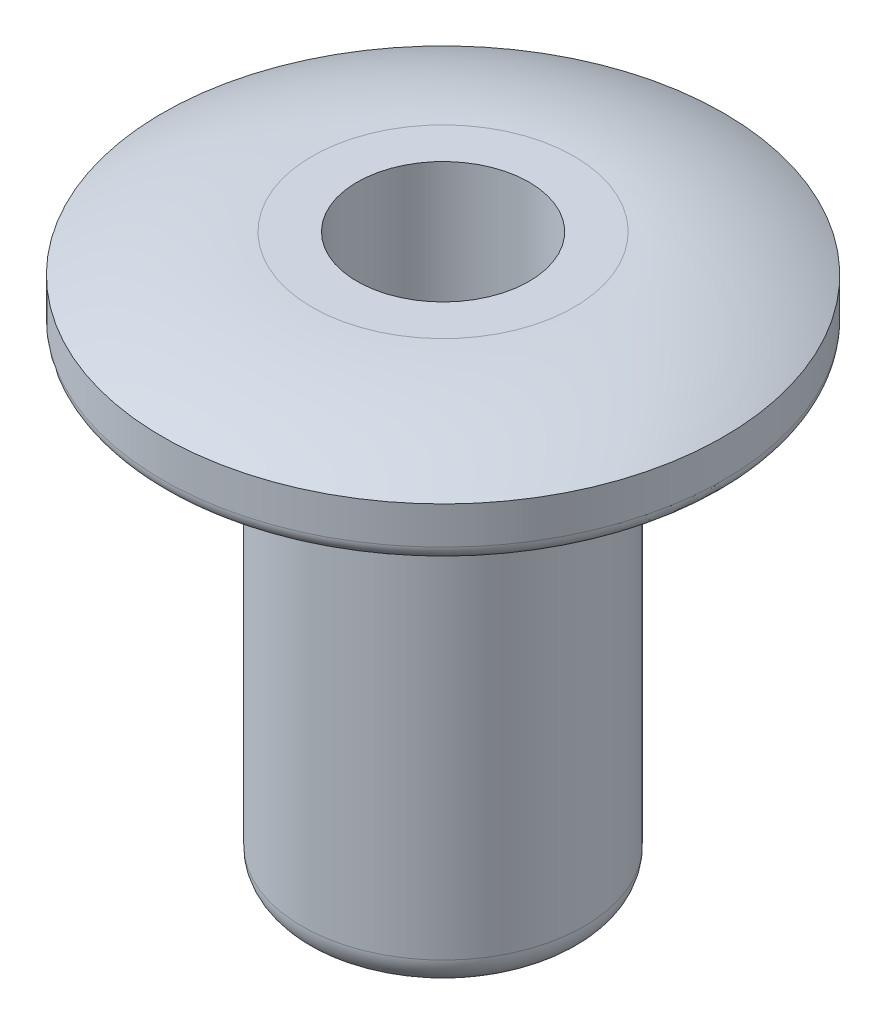
ISO-10303-21;
HEADER;
FILE_DESCRIPTION(('STEP AP214'),'2;1');
FILE_NAME('part.step','',(''),(''),'','','');
FILE_SCHEMA(('AUTOMOTIVE_DESIGN { 1 0 10303 214 1 1 1 1 }'));
ENDSEC;
DATA;
#1=APPLICATION_CONTEXT('core data for automotive mechanical design processes');
#2=APPLICATION_PROTOCOL_DEFINITION('international standard','automotive_design',2000,#1);
#3=PRODUCT_CONTEXT('',#1,'mechanical');
#4=PRODUCT('Part','Part','',(#3));
#5=PRODUCT_RELATED_PRODUCT_CATEGORY('part','',(#4));
#6=PRODUCT_DEFINITION_FORMATION('','',#4);
#7=PRODUCT_DEFINITION_CONTEXT('part definition',#1,'design');
#8=PRODUCT_DEFINITION('design','',#6,#7);
#9=PRODUCT_DEFINITION_SHAPE('','',#8);
#10=(LENGTH_UNIT() NAMED_UNIT(*) SI_UNIT(.MILLI.,.METRE.));
#11=(NAMED_UNIT(*) PLANE_ANGLE_UNIT() SI_UNIT($,.RADIAN.));
#12=(NAMED_UNIT(*) SI_UNIT($,.STERADIAN.) SOLID_ANGLE_UNIT());
#13=UNCERTAINTY_MEASURE_WITH_UNIT(LENGTH_MEASURE(1.E-05),#10,'distance_accuracy_value','');
#14=(GEOMETRIC_REPRESENTATION_CONTEXT(3) GLOBAL_UNCERTAINTY_ASSIGNED_CONTEXT((#13)) GLOBAL_UNIT_ASSIGNED_CONTEXT((#10,
#11,#12)) REPRESENTATION_CONTEXT('',''));
#15=CARTESIAN_POINT('',(0.,0.,0.));
#16=DIRECTION('',(0.,0.,1.));
#17=DIRECTION('',(1.,0.,0.));
#18=AXIS2_PLACEMENT_3D('',#15,#16,#17);
#19=CARTESIAN_POINT('',(0.,4.12749999999999,-2.2225));
#20=DIRECTION('',(1.,0.,0.));
#21=DIRECTION('',(0.,0.,-1.));
#22=AXIS2_PLACEMENT_3D('',#19,#20,#21);
#23=CIRCLE('',#22,5.39750000000001);
#24=TRIMMED_CURVE('',#23,(PARAMETER_VALUE(-1.99518603538808)),
(PARAMETER_VALUE(1.99518603538808)),.T.,.PARAMETER.);
#25=CARTESIAN_POINT('',(0.,4.12749999999999,0.));
#26=DIRECTION('',(0.,-1.,0.));
#27=AXIS1_PLACEMENT('',#25,#26);
#28=SURFACE_OF_REVOLUTION('',#24,#27);
#29=CARTESIAN_POINT('',(0.,8.89,0.));
#30=DIRECTION('',(0.,-1.,0.));
#31=DIRECTION('',(0.,0.,-1.));
#32=AXIS2_PLACEMENT_3D('',#29,#30,#31);
#33=CIRCLE('',#32,4.7625);
#34=CARTESIAN_POINT('',(0.,8.89,-4.7625));
#35=VERTEX_POINT('',#34);
#36=EDGE_CURVE('E58',#35,#35,#33,.T.);
#37=ORIENTED_EDGE('',*,*,#36,.F.);
#38=EDGE_LOOP('',(#37));
#39=FACE_BOUND('',#38,.T.);
#40=CARTESIAN_POINT('',(0.,9.525,0.));
#41=DIRECTION('',(0.,-1.,0.));
#42=DIRECTION('',(0.,0.,-1.));
#43=AXIS2_PLACEMENT_3D('',#40,#41,#42);
#44=CIRCLE('',#43,2.2225);
#45=CARTESIAN_POINT('',(0.,9.525,-2.2225));
#46=VERTEX_POINT('',#45);
#47=CARTESIAN_POINT('',(0.,9.525,2.2225));
#48=VERTEX_POINT('',#47);
#49=EDGE_CURVE('E54',#46,#48,#44,.T.);
#50=ORIENTED_EDGE('',*,*,#49,.T.);
#51=CARTESIAN_POINT('',(0.,9.525,0.));
#52=DIRECTION('',(0.,-1.,0.));
#53=DIRECTION('',(0.,0.,1.));
#54=AXIS2_PLACEMENT_3D('',#51,#52,#53);
#55=CIRCLE('',#54,2.2225);
#56=EDGE_CURVE('E52',#48,#46,#55,.T.);
#57=ORIENTED_EDGE('',*,*,#56,.T.);
#58=EDGE_LOOP('',(#50,#57));
#59=FACE_BOUND('',#58,.T.);
#60=ADVANCED_FACE('F17',(#39,#59),#28,.F.);
#61=CARTESIAN_POINT('',(-1.4605,9.525,0.));
#62=DIRECTION('',(0.,-1.,0.));
#63=DIRECTION('',(0.,0.,-1.));
#64=AXIS2_PLACEMENT_3D('',#61,#62,#63);
#65=PLANE('',#64);
#66=CARTESIAN_POINT('',(0.,9.525,0.));
#67=DIRECTION('',(0.,-1.,0.));
#68=DIRECTION('',(0.,0.,-1.));
#69=AXIS2_PLACEMENT_3D('',#66,#67,#68);
#70=CIRCLE('',#69,1.4605);
#71=CARTESIAN_POINT('',(0.,9.525,-1.4605));
#72=VERTEX_POINT('',#71);
#73=EDGE_CURVE('E90',#72,#72,#70,.T.);
#74=ORIENTED_EDGE('',*,*,#73,.T.);
#75=EDGE_LOOP('',(#74));
#76=FACE_BOUND('',#75,.T.);
#77=ORIENTED_EDGE('',*,*,#56,.F.);
#78=ORIENTED_EDGE('',*,*,#49,.F.);
#79=EDGE_LOOP('',(#77,#78));
#80=FACE_BOUND('',#79,.T.);
#81=ADVANCED_FACE('F61',(#76,#80),#65,.F.);
#82=CARTESIAN_POINT('',(0.,0.,0.));
#83=DIRECTION('',(0.,-1.,0.));
#84=DIRECTION('',(0.,0.,-1.));
#85=AXIS2_PLACEMENT_3D('',#82,#83,#84);
#86=CYLINDRICAL_SURFACE('',#85,4.7625);
#87=CARTESIAN_POINT('',(0.,8.255,0.));
#88=DIRECTION('',(0.,-1.,0.));
#89=DIRECTION('',(0.,0.,-1.));
#90=AXIS2_PLACEMENT_3D('',#87,#88,#89);
#91=CIRCLE('',#90,4.7625);
#92=CARTESIAN_POINT('',(0.,8.255,-4.7625));
#93=VERTEX_POINT('',#92);
#94=EDGE_CURVE('E64',#93,#93,#91,.T.);
#95=ORIENTED_EDGE('',*,*,#94,.F.);
#96=EDGE_LOOP('',(#95));
#97=FACE_BOUND('',#96,.T.);
#98=ORIENTED_EDGE('',*,*,#36,.T.);
#99=EDGE_LOOP('',(#98));
#100=FACE_BOUND('',#99,.T.);
#101=ADVANCED_FACE('F77',(#97,#100),#86,.T.);
#102=CARTESIAN_POINT('',(0.,0.,0.));
#103=DIRECTION('',(0.,-1.,0.));
#104=DIRECTION('',(0.,0.,-1.));
#105=AXIS2_PLACEMENT_3D('',#102,#103,#104);
#106=CYLINDRICAL_SURFACE('',#105,1.4605);
#107=ORIENTED_EDGE('',*,*,#73,.F.);
#108=EDGE_LOOP('',(#107));
#109=FACE_BOUND('',#108,.T.);
#110=CARTESIAN_POINT('',(0.,0.,0.));
#111=DIRECTION('',(0.,-1.,0.));
#112=DIRECTION('',(0.,0.,-1.));
#113=AXIS2_PLACEMENT_3D('',#110,#111,#112);
#114=CIRCLE('',#113,1.4605);
#115=CARTESIAN_POINT('',(0.,0.,-1.4605));
#116=VERTEX_POINT('',#115);
#117=EDGE_CURVE('E98',#116,#116,#114,.T.);
#118=ORIENTED_EDGE('',*,*,#117,.T.);
#119=EDGE_LOOP('',(#118));
#120=FACE_BOUND('',#119,.T.);
#121=ADVANCED_FACE('F200',(#109,#120),#106,.F.);
#122=CARTESIAN_POINT('',(0.,8.255,0.));
#123=DIRECTION('',(0.,-1.,0.));
#124=DIRECTION('',(0.,0.,-1.));
#125=AXIS2_PLACEMENT_3D('',#122,#123,#124);
#126=TOROIDAL_SURFACE('',#125,4.5085,0.254);
#127=CARTESIAN_POINT('',(0.,8.001,0.));
#128=DIRECTION('',(0.,1.,0.));
#129=DIRECTION('',(0.,0.,-1.));
#130=AXIS2_PLACEMENT_3D('',#127,#128,#129);
#131=CIRCLE('',#130,4.5085);
#132=CARTESIAN_POINT('',(0.,8.001,-4.5085));
#133=VERTEX_POINT('',#132);
#134=CARTESIAN_POINT('',(0.,8.001,4.5085));
#135=VERTEX_POINT('',#134);
#136=EDGE_CURVE('E133',#133,#135,#131,.T.);
#137=ORIENTED_EDGE('',*,*,#136,.T.);
#138=CARTESIAN_POINT('',(0.,8.001,0.));
#139=DIRECTION('',(0.,1.,0.));
#140=DIRECTION('',(0.,0.,1.));
#141=AXIS2_PLACEMENT_3D('',#138,#139,#140);
#142=CIRCLE('',#141,4.5085);
#143=EDGE_CURVE('E143',#135,#133,#142,.T.);
#144=ORIENTED_EDGE('',*,*,#143,.T.);
#145=EDGE_LOOP('',(#137,#144));
#146=FACE_BOUND('',#145,.T.);
#147=ORIENTED_EDGE('',*,*,#94,.T.);
#148=EDGE_LOOP('',(#147));
#149=FACE_BOUND('',#148,.T.);
#150=ADVANCED_FACE('F166',(#146,#149),#126,.T.);
#151=CARTESIAN_POINT('',(-2.39395,0.,0.));
#152=DIRECTION('',(0.,1.,0.));
#153=DIRECTION('',(0.,0.,1.));
#154=AXIS2_PLACEMENT_3D('',#151,#152,#153);
#155=PLANE('',#154);
#156=ORIENTED_EDGE('',*,*,#117,.F.);
#157=EDGE_LOOP('',(#156));
#158=FACE_BOUND('',#157,.T.);
#159=CARTESIAN_POINT('',(0.,0.,0.));
#160=DIRECTION('',(0.,1.,0.));
#161=DIRECTION('',(0.,0.,1.));
#162=AXIS2_PLACEMENT_3D('',#159,#160,#161);
#163=CIRCLE('',#162,1.88595);
#164=CARTESIAN_POINT('',(0.,0.,1.88595));
#165=VERTEX_POINT('',#164);
#166=CARTESIAN_POINT('',(0.,0.,-1.88595));
#167=VERTEX_POINT('',#166);
#168=EDGE_CURVE('E153',#165,#167,#163,.T.);
#169=ORIENTED_EDGE('',*,*,#168,.F.);
#170=CARTESIAN_POINT('',(0.,0.,0.));
#171=DIRECTION('',(0.,1.,0.));
#172=DIRECTION('',(0.,0.,-1.));
#173=AXIS2_PLACEMENT_3D('',#170,#171,#172);
#174=CIRCLE('',#173,1.88595);
#175=EDGE_CURVE('E37',#167,#165,#174,.T.);
#176=ORIENTED_EDGE('',*,*,#175,.F.);
#177=EDGE_LOOP('',(#169,#176));
#178=FACE_BOUND('',#177,.T.);
#179=ADVANCED_FACE('F157',(#158,#178),#155,.F.);
#180=CARTESIAN_POINT('',(-4.5085,8.001,0.));
#181=DIRECTION('',(0.,1.,0.));
#182=DIRECTION('',(0.,0.,1.));
#183=AXIS2_PLACEMENT_3D('',#180,#181,#182);
#184=PLANE('',#183);
#185=ORIENTED_EDGE('',*,*,#136,.F.);
#186=ORIENTED_EDGE('',*,*,#143,.F.);
#187=EDGE_LOOP('',(#185,#186));
#188=FACE_BOUND('',#187,.T.);
#189=CARTESIAN_POINT('',(0.,8.001,0.));
#190=DIRECTION('',(0.,-1.,0.));
#191=DIRECTION('',(0.,0.,-1.));
#192=AXIS2_PLACEMENT_3D('',#189,#190,#191);
#193=CIRCLE('',#192,2.39395);
#194=CARTESIAN_POINT('',(0.,8.001,-2.39395));
#195=VERTEX_POINT('',#194);
#196=EDGE_CURVE('E29',#195,#195,#193,.T.);
#197=ORIENTED_EDGE('',*,*,#196,.F.);
#198=EDGE_LOOP('',(#197));
#199=FACE_BOUND('',#198,.T.);
#200=ADVANCED_FACE('F121',(#188,#199),#184,.F.);
#201=CARTESIAN_POINT('',(0.,0.508,0.));
#202=DIRECTION('',(0.,1.,0.));
#203=DIRECTION('',(0.,0.,1.));
#204=AXIS2_PLACEMENT_3D('',#201,#202,#203);
#205=TOROIDAL_SURFACE('',#204,1.88595,0.508);
#206=CARTESIAN_POINT('',(0.,0.508,0.));
#207=DIRECTION('',(0.,-1.,0.));
#208=DIRECTION('',(0.,0.,-1.));
#209=AXIS2_PLACEMENT_3D('',#206,#207,#208);
#210=CIRCLE('',#209,2.39395);
#211=CARTESIAN_POINT('',(0.,0.508,-2.39395));
#212=VERTEX_POINT('',#211);
#213=EDGE_CURVE('E11',#212,#212,#210,.F.);
#214=ORIENTED_EDGE('',*,*,#213,.F.);
#215=EDGE_LOOP('',(#214));
#216=FACE_BOUND('',#215,.T.);
#217=ORIENTED_EDGE('',*,*,#168,.T.);
#218=ORIENTED_EDGE('',*,*,#175,.T.);
#219=EDGE_LOOP('',(#217,#218));
#220=FACE_BOUND('',#219,.T.);
#221=ADVANCED_FACE('F109',(#216,#220),#205,.T.);
#222=CARTESIAN_POINT('',(0.,0.,0.));
#223=DIRECTION('',(0.,-1.,0.));
#224=DIRECTION('',(0.,0.,-1.));
#225=AXIS2_PLACEMENT_3D('',#222,#223,#224);
#226=CYLINDRICAL_SURFACE('',#225,2.39395);
#227=ORIENTED_EDGE('',*,*,#213,.T.);
#228=EDGE_LOOP('',(#227));
#229=FACE_BOUND('',#228,.T.);
#230=ORIENTED_EDGE('',*,*,#196,.T.);
#231=EDGE_LOOP('',(#230));
#232=FACE_BOUND('',#231,.T.);
#233=ADVANCED_FACE('F120',(#229,#232),#226,.T.);
#234=CLOSED_SHELL('',(#60,#81,#101,#121,#150,#179,#200,#221,#233));
#235=MANIFOLD_SOLID_BREP('B1',#234);
#236=ADVANCED_BREP_SHAPE_REPRESENTATION('',(#18,#235),#14);
#237=SHAPE_DEFINITION_REPRESENTATION(#9,#236);
ENDSEC;
END-ISO-10303-21;
